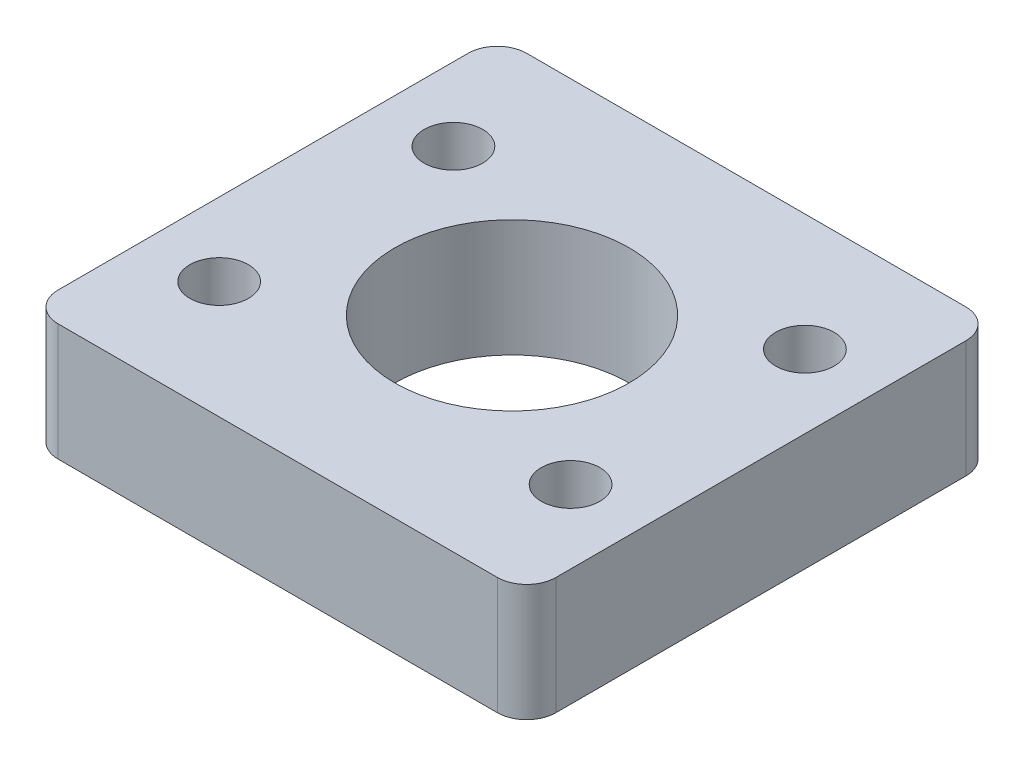
ISO-10303-21;
HEADER;
FILE_DESCRIPTION(('STEP AP214'),'2;1');
FILE_NAME('part.step','',(''),(''),'','','');
FILE_SCHEMA(('AUTOMOTIVE_DESIGN { 1 0 10303 214 1 1 1 1 }'));
ENDSEC;
DATA;
#1=APPLICATION_CONTEXT('core data for automotive mechanical design processes');
#2=APPLICATION_PROTOCOL_DEFINITION('international standard','automotive_design',2000,#1);
#3=PRODUCT_CONTEXT('',#1,'mechanical');
#4=PRODUCT('Part','Part','',(#3));
#5=PRODUCT_RELATED_PRODUCT_CATEGORY('part','',(#4));
#6=PRODUCT_DEFINITION_FORMATION('','',#4);
#7=PRODUCT_DEFINITION_CONTEXT('part definition',#1,'design');
#8=PRODUCT_DEFINITION('design','',#6,#7);
#9=PRODUCT_DEFINITION_SHAPE('','',#8);
#10=(LENGTH_UNIT() NAMED_UNIT(*) SI_UNIT(.MILLI.,.METRE.));
#11=(NAMED_UNIT(*) PLANE_ANGLE_UNIT() SI_UNIT($,.RADIAN.));
#12=(NAMED_UNIT(*) SI_UNIT($,.STERADIAN.) SOLID_ANGLE_UNIT());
#13=UNCERTAINTY_MEASURE_WITH_UNIT(LENGTH_MEASURE(1.E-05),#10,'distance_accuracy_value','');
#14=(GEOMETRIC_REPRESENTATION_CONTEXT(3) GLOBAL_UNCERTAINTY_ASSIGNED_CONTEXT((#13)) GLOBAL_UNIT_ASSIGNED_CONTEXT((#10,
#11,#12)) REPRESENTATION_CONTEXT('',''));
#15=CARTESIAN_POINT('',(0.,0.,0.));
#16=DIRECTION('',(0.,0.,1.));
#17=DIRECTION('',(1.,0.,0.));
#18=AXIS2_PLACEMENT_3D('',#15,#16,#17);
#19=CARTESIAN_POINT('',(0.,4.,0.));
#20=DIRECTION('',(0.,-1.,0.));
#21=DIRECTION('',(0.,0.,-1.));
#22=AXIS2_PLACEMENT_3D('',#19,#20,#21);
#23=PLANE('',#22);
#24=DIRECTION('',(0.,0.,-1.));
#25=VECTOR('',#24,1.);
#26=CARTESIAN_POINT('',(8.5,4.,8.));
#27=LINE('',#26,#25);
#28=CARTESIAN_POINT('',(8.5,4.,7.));
#29=VERTEX_POINT('',#28);
#30=CARTESIAN_POINT('',(8.5,4.,-7.));
#31=VERTEX_POINT('',#30);
#32=EDGE_CURVE('E144',#29,#31,#27,.T.);
#33=ORIENTED_EDGE('',*,*,#32,.T.);
#34=CARTESIAN_POINT('',(7.5,4.,-7.));
#35=DIRECTION('',(0.,-1.,0.));
#36=DIRECTION('',(0.,0.,-1.));
#37=AXIS2_PLACEMENT_3D('',#34,#35,#36);
#38=CIRCLE('',#37,1.);
#39=CARTESIAN_POINT('',(7.5,4.,-8.));
#40=VERTEX_POINT('',#39);
#41=EDGE_CURVE('E159',#31,#40,#38,.F.);
#42=ORIENTED_EDGE('',*,*,#41,.T.);
#43=DIRECTION('',(-1.,0.,0.));
#44=VECTOR('',#43,1.);
#45=CARTESIAN_POINT('',(-8.5,4.,-8.));
#46=LINE('',#45,#44);
#47=CARTESIAN_POINT('',(-7.5,4.,-8.));
#48=VERTEX_POINT('',#47);
#49=EDGE_CURVE('E126',#40,#48,#46,.T.);
#50=ORIENTED_EDGE('',*,*,#49,.T.);
#51=CARTESIAN_POINT('',(-7.5,4.,-7.));
#52=DIRECTION('',(0.,-1.,0.));
#53=DIRECTION('',(0.,0.,-1.));
#54=AXIS2_PLACEMENT_3D('',#51,#52,#53);
#55=CIRCLE('',#54,1.);
#56=CARTESIAN_POINT('',(-8.5,4.,-7.));
#57=VERTEX_POINT('',#56);
#58=EDGE_CURVE('E157',#48,#57,#55,.F.);
#59=ORIENTED_EDGE('',*,*,#58,.T.);
#60=DIRECTION('',(0.,0.,1.));
#61=VECTOR('',#60,1.);
#62=CARTESIAN_POINT('',(-8.5,4.,8.));
#63=LINE('',#62,#61);
#64=CARTESIAN_POINT('',(-8.5,4.,7.));
#65=VERTEX_POINT('',#64);
#66=EDGE_CURVE('E179',#57,#65,#63,.T.);
#67=ORIENTED_EDGE('',*,*,#66,.T.);
#68=CARTESIAN_POINT('',(-7.5,4.,7.));
#69=DIRECTION('',(0.,-1.,0.));
#70=DIRECTION('',(0.,0.,-1.));
#71=AXIS2_PLACEMENT_3D('',#68,#69,#70);
#72=CIRCLE('',#71,1.);
#73=CARTESIAN_POINT('',(-7.5,4.,8.));
#74=VERTEX_POINT('',#73);
#75=EDGE_CURVE('E61',#65,#74,#72,.F.);
#76=ORIENTED_EDGE('',*,*,#75,.T.);
#77=DIRECTION('',(1.,0.,0.));
#78=VECTOR('',#77,1.);
#79=CARTESIAN_POINT('',(-8.5,4.,8.));
#80=LINE('',#79,#78);
#81=CARTESIAN_POINT('',(7.5,4.,8.));
#82=VERTEX_POINT('',#81);
#83=EDGE_CURVE('E145',#74,#82,#80,.T.);
#84=ORIENTED_EDGE('',*,*,#83,.T.);
#85=CARTESIAN_POINT('',(7.5,4.,7.));
#86=DIRECTION('',(0.,-1.,0.));
#87=DIRECTION('',(0.,0.,-1.));
#88=AXIS2_PLACEMENT_3D('',#85,#86,#87);
#89=CIRCLE('',#88,1.);
#90=EDGE_CURVE('E155',#82,#29,#89,.F.);
#91=ORIENTED_EDGE('',*,*,#90,.T.);
#92=EDGE_LOOP('',(#33,#42,#50,#59,#67,#76,#84,#91));
#93=FACE_BOUND('',#92,.T.);
#94=CARTESIAN_POINT('',(6.,4.,-4.));
#95=DIRECTION('',(0.,1.,0.));
#96=DIRECTION('',(0.,0.,1.));
#97=AXIS2_PLACEMENT_3D('',#94,#95,#96);
#98=CIRCLE('',#97,1.);
#99=CARTESIAN_POINT('',(6.,4.,-3.));
#100=VERTEX_POINT('',#99);
#101=EDGE_CURVE('E139',#100,#100,#98,.T.);
#102=ORIENTED_EDGE('',*,*,#101,.F.);
#103=EDGE_LOOP('',(#102));
#104=FACE_BOUND('',#103,.T.);
#105=CARTESIAN_POINT('',(-6.,4.,-4.));
#106=DIRECTION('',(0.,1.,0.));
#107=DIRECTION('',(0.,0.,-1.));
#108=AXIS2_PLACEMENT_3D('',#105,#106,#107);
#109=CIRCLE('',#108,1.);
#110=CARTESIAN_POINT('',(-6.,4.,-5.));
#111=VERTEX_POINT('',#110);
#112=EDGE_CURVE('E194',#111,#111,#109,.T.);
#113=ORIENTED_EDGE('',*,*,#112,.F.);
#114=EDGE_LOOP('',(#113));
#115=FACE_BOUND('',#114,.T.);
#116=CARTESIAN_POINT('',(6.,4.,4.));
#117=DIRECTION('',(0.,1.,0.));
#118=DIRECTION('',(0.,0.,-1.));
#119=AXIS2_PLACEMENT_3D('',#116,#117,#118);
#120=CIRCLE('',#119,1.);
#121=CARTESIAN_POINT('',(6.,4.,3.));
#122=VERTEX_POINT('',#121);
#123=EDGE_CURVE('E198',#122,#122,#120,.T.);
#124=ORIENTED_EDGE('',*,*,#123,.F.);
#125=EDGE_LOOP('',(#124));
#126=FACE_BOUND('',#125,.T.);
#127=CARTESIAN_POINT('',(-6.,4.,4.));
#128=DIRECTION('',(0.,1.,0.));
#129=DIRECTION('',(0.,0.,1.));
#130=AXIS2_PLACEMENT_3D('',#127,#128,#129);
#131=CIRCLE('',#130,1.);
#132=CARTESIAN_POINT('',(-6.,4.,5.));
#133=VERTEX_POINT('',#132);
#134=EDGE_CURVE('E202',#133,#133,#131,.T.);
#135=ORIENTED_EDGE('',*,*,#134,.F.);
#136=EDGE_LOOP('',(#135));
#137=FACE_BOUND('',#136,.T.);
#138=CARTESIAN_POINT('',(0.,4.,0.));
#139=DIRECTION('',(0.,1.,0.));
#140=DIRECTION('',(0.,0.,1.));
#141=AXIS2_PLACEMENT_3D('',#138,#139,#140);
#142=CIRCLE('',#141,4.);
#143=CARTESIAN_POINT('',(0.,4.,4.));
#144=VERTEX_POINT('',#143);
#145=EDGE_CURVE('E205',#144,#144,#142,.T.);
#146=ORIENTED_EDGE('',*,*,#145,.F.);
#147=EDGE_LOOP('',(#146));
#148=FACE_BOUND('',#147,.T.);
#149=ADVANCED_FACE('F41',(#93,#104,#115,#126,#137,#148),#23,.F.);
#150=CARTESIAN_POINT('',(0.,0.,0.));
#151=DIRECTION('',(0.,-1.,0.));
#152=DIRECTION('',(0.,0.,-1.));
#153=AXIS2_PLACEMENT_3D('',#150,#151,#152);
#154=PLANE('',#153);
#155=CARTESIAN_POINT('',(-6.,0.,4.));
#156=DIRECTION('',(0.,1.,0.));
#157=DIRECTION('',(0.,0.,1.));
#158=AXIS2_PLACEMENT_3D('',#155,#156,#157);
#159=CIRCLE('',#158,1.);
#160=CARTESIAN_POINT('',(-6.,0.,5.));
#161=VERTEX_POINT('',#160);
#162=EDGE_CURVE('E207',#161,#161,#159,.T.);
#163=ORIENTED_EDGE('',*,*,#162,.T.);
#164=EDGE_LOOP('',(#163));
#165=FACE_BOUND('',#164,.T.);
#166=CARTESIAN_POINT('',(-6.,0.,-4.));
#167=DIRECTION('',(0.,1.,0.));
#168=DIRECTION('',(0.,0.,-1.));
#169=AXIS2_PLACEMENT_3D('',#166,#167,#168);
#170=CIRCLE('',#169,1.);
#171=CARTESIAN_POINT('',(-6.,0.,-5.));
#172=VERTEX_POINT('',#171);
#173=EDGE_CURVE('E218',#172,#172,#170,.T.);
#174=ORIENTED_EDGE('',*,*,#173,.T.);
#175=EDGE_LOOP('',(#174));
#176=FACE_BOUND('',#175,.T.);
#177=DIRECTION('',(-1.,0.,0.));
#178=VECTOR('',#177,1.);
#179=CARTESIAN_POINT('',(-8.5,0.,-8.));
#180=LINE('',#179,#178);
#181=CARTESIAN_POINT('',(7.5,0.,-8.));
#182=VERTEX_POINT('',#181);
#183=CARTESIAN_POINT('',(-7.5,0.,-8.));
#184=VERTEX_POINT('',#183);
#185=EDGE_CURVE('E123',#182,#184,#180,.T.);
#186=ORIENTED_EDGE('',*,*,#185,.F.);
#187=CARTESIAN_POINT('',(7.5,0.,-7.));
#188=DIRECTION('',(0.,-1.,0.));
#189=DIRECTION('',(0.,0.,-1.));
#190=AXIS2_PLACEMENT_3D('',#187,#188,#189);
#191=CIRCLE('',#190,1.);
#192=CARTESIAN_POINT('',(8.5,0.,-7.));
#193=VERTEX_POINT('',#192);
#194=EDGE_CURVE('E106',#182,#193,#191,.T.);
#195=ORIENTED_EDGE('',*,*,#194,.T.);
#196=DIRECTION('',(0.,0.,-1.));
#197=VECTOR('',#196,1.);
#198=CARTESIAN_POINT('',(8.5,0.,8.));
#199=LINE('',#198,#197);
#200=CARTESIAN_POINT('',(8.5,0.,7.));
#201=VERTEX_POINT('',#200);
#202=EDGE_CURVE('E134',#201,#193,#199,.T.);
#203=ORIENTED_EDGE('',*,*,#202,.F.);
#204=CARTESIAN_POINT('',(7.5,0.,7.));
#205=DIRECTION('',(0.,-1.,0.));
#206=DIRECTION('',(0.,0.,-1.));
#207=AXIS2_PLACEMENT_3D('',#204,#205,#206);
#208=CIRCLE('',#207,1.);
#209=CARTESIAN_POINT('',(7.5,0.,8.));
#210=VERTEX_POINT('',#209);
#211=EDGE_CURVE('E148',#201,#210,#208,.T.);
#212=ORIENTED_EDGE('',*,*,#211,.T.);
#213=DIRECTION('',(1.,0.,0.));
#214=VECTOR('',#213,1.);
#215=CARTESIAN_POINT('',(-8.5,0.,8.));
#216=LINE('',#215,#214);
#217=CARTESIAN_POINT('',(-7.5,0.,8.));
#218=VERTEX_POINT('',#217);
#219=EDGE_CURVE('E137',#218,#210,#216,.T.);
#220=ORIENTED_EDGE('',*,*,#219,.F.);
#221=CARTESIAN_POINT('',(-7.5,0.,7.));
#222=DIRECTION('',(0.,-1.,0.));
#223=DIRECTION('',(0.,0.,-1.));
#224=AXIS2_PLACEMENT_3D('',#221,#222,#223);
#225=CIRCLE('',#224,1.);
#226=CARTESIAN_POINT('',(-8.5,0.,7.));
#227=VERTEX_POINT('',#226);
#228=EDGE_CURVE('E127',#218,#227,#225,.T.);
#229=ORIENTED_EDGE('',*,*,#228,.T.);
#230=DIRECTION('',(0.,0.,1.));
#231=VECTOR('',#230,1.);
#232=CARTESIAN_POINT('',(-8.5,0.,8.));
#233=LINE('',#232,#231);
#234=CARTESIAN_POINT('',(-8.5,0.,-7.));
#235=VERTEX_POINT('',#234);
#236=EDGE_CURVE('E133',#235,#227,#233,.T.);
#237=ORIENTED_EDGE('',*,*,#236,.F.);
#238=CARTESIAN_POINT('',(-7.5,0.,-7.));
#239=DIRECTION('',(0.,-1.,0.));
#240=DIRECTION('',(0.,0.,-1.));
#241=AXIS2_PLACEMENT_3D('',#238,#239,#240);
#242=CIRCLE('',#241,1.);
#243=EDGE_CURVE('E117',#235,#184,#242,.T.);
#244=ORIENTED_EDGE('',*,*,#243,.T.);
#245=EDGE_LOOP('',(#186,#195,#203,#212,#220,#229,#237,#244));
#246=FACE_BOUND('',#245,.T.);
#247=CARTESIAN_POINT('',(6.,0.,-4.));
#248=DIRECTION('',(0.,1.,0.));
#249=DIRECTION('',(0.,0.,1.));
#250=AXIS2_PLACEMENT_3D('',#247,#248,#249);
#251=CIRCLE('',#250,1.);
#252=CARTESIAN_POINT('',(6.,0.,-3.));
#253=VERTEX_POINT('',#252);
#254=EDGE_CURVE('E182',#253,#253,#251,.T.);
#255=ORIENTED_EDGE('',*,*,#254,.T.);
#256=EDGE_LOOP('',(#255));
#257=FACE_BOUND('',#256,.T.);
#258=CARTESIAN_POINT('',(6.,0.,4.));
#259=DIRECTION('',(0.,1.,0.));
#260=DIRECTION('',(0.,0.,-1.));
#261=AXIS2_PLACEMENT_3D('',#258,#259,#260);
#262=CIRCLE('',#261,1.);
#263=CARTESIAN_POINT('',(6.,0.,3.));
#264=VERTEX_POINT('',#263);
#265=EDGE_CURVE('E215',#264,#264,#262,.T.);
#266=ORIENTED_EDGE('',*,*,#265,.T.);
#267=EDGE_LOOP('',(#266));
#268=FACE_BOUND('',#267,.T.);
#269=CARTESIAN_POINT('',(0.,0.,0.));
#270=DIRECTION('',(0.,1.,0.));
#271=DIRECTION('',(0.,0.,1.));
#272=AXIS2_PLACEMENT_3D('',#269,#270,#271);
#273=CIRCLE('',#272,4.);
#274=CARTESIAN_POINT('',(0.,0.,4.));
#275=VERTEX_POINT('',#274);
#276=EDGE_CURVE('E208',#275,#275,#273,.T.);
#277=ORIENTED_EDGE('',*,*,#276,.T.);
#278=EDGE_LOOP('',(#277));
#279=FACE_BOUND('',#278,.T.);
#280=ADVANCED_FACE('F130',(#165,#176,#246,#257,#268,#279),#154,.T.);
#281=CARTESIAN_POINT('',(8.5,4.,8.));
#282=DIRECTION('',(-1.,0.,0.));
#283=DIRECTION('',(0.,0.,1.));
#284=AXIS2_PLACEMENT_3D('',#281,#282,#283);
#285=PLANE('',#284);
#286=ORIENTED_EDGE('',*,*,#202,.T.);
#287=DIRECTION('',(0.,-1.,0.));
#288=VECTOR('',#287,1.);
#289=CARTESIAN_POINT('',(8.5,4.,-7.));
#290=LINE('',#289,#288);
#291=EDGE_CURVE('E111',#193,#31,#290,.F.);
#292=ORIENTED_EDGE('',*,*,#291,.T.);
#293=ORIENTED_EDGE('',*,*,#32,.F.);
#294=DIRECTION('',(0.,-1.,0.));
#295=VECTOR('',#294,1.);
#296=CARTESIAN_POINT('',(8.5,4.,7.));
#297=LINE('',#296,#295);
#298=EDGE_CURVE('E116',#29,#201,#297,.T.);
#299=ORIENTED_EDGE('',*,*,#298,.T.);
#300=EDGE_LOOP('',(#286,#292,#293,#299));
#301=FACE_BOUND('',#300,.T.);
#302=ADVANCED_FACE('F176',(#301),#285,.F.);
#303=CARTESIAN_POINT('',(-8.5,4.,-8.));
#304=DIRECTION('',(0.,0.,1.));
#305=DIRECTION('',(1.,0.,0.));
#306=AXIS2_PLACEMENT_3D('',#303,#304,#305);
#307=PLANE('',#306);
#308=ORIENTED_EDGE('',*,*,#49,.F.);
#309=DIRECTION('',(0.,-1.,0.));
#310=VECTOR('',#309,1.);
#311=CARTESIAN_POINT('',(7.5,4.,-8.));
#312=LINE('',#311,#310);
#313=EDGE_CURVE('E110',#40,#182,#312,.T.);
#314=ORIENTED_EDGE('',*,*,#313,.T.);
#315=ORIENTED_EDGE('',*,*,#185,.T.);
#316=DIRECTION('',(0.,-1.,0.));
#317=VECTOR('',#316,1.);
#318=CARTESIAN_POINT('',(-7.5,4.,-8.));
#319=LINE('',#318,#317);
#320=EDGE_CURVE('E128',#184,#48,#319,.F.);
#321=ORIENTED_EDGE('',*,*,#320,.T.);
#322=EDGE_LOOP('',(#308,#314,#315,#321));
#323=FACE_BOUND('',#322,.T.);
#324=ADVANCED_FACE('F122',(#323),#307,.F.);
#325=CARTESIAN_POINT('',(-8.5,4.,8.));
#326=DIRECTION('',(1.,0.,0.));
#327=DIRECTION('',(0.,0.,-1.));
#328=AXIS2_PLACEMENT_3D('',#325,#326,#327);
#329=PLANE('',#328);
#330=ORIENTED_EDGE('',*,*,#66,.F.);
#331=DIRECTION('',(0.,-1.,0.));
#332=VECTOR('',#331,1.);
#333=CARTESIAN_POINT('',(-8.5,4.,-7.));
#334=LINE('',#333,#332);
#335=EDGE_CURVE('E163',#57,#235,#334,.T.);
#336=ORIENTED_EDGE('',*,*,#335,.T.);
#337=ORIENTED_EDGE('',*,*,#236,.T.);
#338=DIRECTION('',(0.,-1.,0.));
#339=VECTOR('',#338,1.);
#340=CARTESIAN_POINT('',(-8.5,4.,7.));
#341=LINE('',#340,#339);
#342=EDGE_CURVE('E161',#227,#65,#341,.F.);
#343=ORIENTED_EDGE('',*,*,#342,.T.);
#344=EDGE_LOOP('',(#330,#336,#337,#343));
#345=FACE_BOUND('',#344,.T.);
#346=ADVANCED_FACE('F239',(#345),#329,.F.);
#347=CARTESIAN_POINT('',(-8.5,4.,8.));
#348=DIRECTION('',(0.,0.,-1.));
#349=DIRECTION('',(-1.,0.,0.));
#350=AXIS2_PLACEMENT_3D('',#347,#348,#349);
#351=PLANE('',#350);
#352=ORIENTED_EDGE('',*,*,#219,.T.);
#353=DIRECTION('',(0.,-1.,0.));
#354=VECTOR('',#353,1.);
#355=CARTESIAN_POINT('',(7.5,4.,8.));
#356=LINE('',#355,#354);
#357=EDGE_CURVE('E11',#210,#82,#356,.F.);
#358=ORIENTED_EDGE('',*,*,#357,.T.);
#359=ORIENTED_EDGE('',*,*,#83,.F.);
#360=DIRECTION('',(0.,-1.,0.));
#361=VECTOR('',#360,1.);
#362=CARTESIAN_POINT('',(-7.5,4.,8.));
#363=LINE('',#362,#361);
#364=EDGE_CURVE('E49',#74,#218,#363,.T.);
#365=ORIENTED_EDGE('',*,*,#364,.T.);
#366=EDGE_LOOP('',(#352,#358,#359,#365));
#367=FACE_BOUND('',#366,.T.);
#368=ADVANCED_FACE('F168',(#367),#351,.F.);
#369=CARTESIAN_POINT('',(6.,4.,-4.));
#370=DIRECTION('',(0.,-1.,0.));
#371=DIRECTION('',(0.,0.,-1.));
#372=AXIS2_PLACEMENT_3D('',#369,#370,#371);
#373=CYLINDRICAL_SURFACE('',#372,1.);
#374=ORIENTED_EDGE('',*,*,#101,.T.);
#375=EDGE_LOOP('',(#374));
#376=FACE_BOUND('',#375,.T.);
#377=ORIENTED_EDGE('',*,*,#254,.F.);
#378=EDGE_LOOP('',(#377));
#379=FACE_BOUND('',#378,.T.);
#380=ADVANCED_FACE('F228',(#376,#379),#373,.F.);
#381=CARTESIAN_POINT('',(-6.,4.,-4.));
#382=DIRECTION('',(0.,-1.,0.));
#383=DIRECTION('',(0.,0.,-1.));
#384=AXIS2_PLACEMENT_3D('',#381,#382,#383);
#385=CYLINDRICAL_SURFACE('',#384,1.);
#386=ORIENTED_EDGE('',*,*,#112,.T.);
#387=EDGE_LOOP('',(#386));
#388=FACE_BOUND('',#387,.T.);
#389=ORIENTED_EDGE('',*,*,#173,.F.);
#390=EDGE_LOOP('',(#389));
#391=FACE_BOUND('',#390,.T.);
#392=ADVANCED_FACE('F230',(#388,#391),#385,.F.);
#393=CARTESIAN_POINT('',(6.,4.,4.));
#394=DIRECTION('',(0.,-1.,0.));
#395=DIRECTION('',(0.,0.,-1.));
#396=AXIS2_PLACEMENT_3D('',#393,#394,#395);
#397=CYLINDRICAL_SURFACE('',#396,1.);
#398=ORIENTED_EDGE('',*,*,#123,.T.);
#399=EDGE_LOOP('',(#398));
#400=FACE_BOUND('',#399,.T.);
#401=ORIENTED_EDGE('',*,*,#265,.F.);
#402=EDGE_LOOP('',(#401));
#403=FACE_BOUND('',#402,.T.);
#404=ADVANCED_FACE('F235',(#400,#403),#397,.F.);
#405=CARTESIAN_POINT('',(-6.,4.,4.));
#406=DIRECTION('',(0.,-1.,0.));
#407=DIRECTION('',(0.,0.,-1.));
#408=AXIS2_PLACEMENT_3D('',#405,#406,#407);
#409=CYLINDRICAL_SURFACE('',#408,1.);
#410=ORIENTED_EDGE('',*,*,#134,.T.);
#411=EDGE_LOOP('',(#410));
#412=FACE_BOUND('',#411,.T.);
#413=ORIENTED_EDGE('',*,*,#162,.F.);
#414=EDGE_LOOP('',(#413));
#415=FACE_BOUND('',#414,.T.);
#416=ADVANCED_FACE('F295',(#412,#415),#409,.F.);
#417=CARTESIAN_POINT('',(0.,4.,0.));
#418=DIRECTION('',(0.,-1.,0.));
#419=DIRECTION('',(0.,0.,-1.));
#420=AXIS2_PLACEMENT_3D('',#417,#418,#419);
#421=CYLINDRICAL_SURFACE('',#420,4.);
#422=ORIENTED_EDGE('',*,*,#145,.T.);
#423=EDGE_LOOP('',(#422));
#424=FACE_BOUND('',#423,.T.);
#425=ORIENTED_EDGE('',*,*,#276,.F.);
#426=EDGE_LOOP('',(#425));
#427=FACE_BOUND('',#426,.T.);
#428=ADVANCED_FACE('F256',(#424,#427),#421,.F.);
#429=CARTESIAN_POINT('',(7.5,4.,-7.));
#430=DIRECTION('',(0.,-1.,0.));
#431=DIRECTION('',(0.,0.,-1.));
#432=AXIS2_PLACEMENT_3D('',#429,#430,#431);
#433=CYLINDRICAL_SURFACE('',#432,1.);
#434=ORIENTED_EDGE('',*,*,#41,.F.);
#435=ORIENTED_EDGE('',*,*,#291,.F.);
#436=ORIENTED_EDGE('',*,*,#194,.F.);
#437=ORIENTED_EDGE('',*,*,#313,.F.);
#438=EDGE_LOOP('',(#434,#435,#436,#437));
#439=FACE_BOUND('',#438,.T.);
#440=ADVANCED_FACE('F109',(#439),#433,.T.);
#441=CARTESIAN_POINT('',(-7.5,4.,-7.));
#442=DIRECTION('',(0.,-1.,0.));
#443=DIRECTION('',(0.,0.,-1.));
#444=AXIS2_PLACEMENT_3D('',#441,#442,#443);
#445=CYLINDRICAL_SURFACE('',#444,1.);
#446=ORIENTED_EDGE('',*,*,#58,.F.);
#447=ORIENTED_EDGE('',*,*,#320,.F.);
#448=ORIENTED_EDGE('',*,*,#243,.F.);
#449=ORIENTED_EDGE('',*,*,#335,.F.);
#450=EDGE_LOOP('',(#446,#447,#448,#449));
#451=FACE_BOUND('',#450,.T.);
#452=ADVANCED_FACE('F255',(#451),#445,.T.);
#453=CARTESIAN_POINT('',(7.5,4.,7.));
#454=DIRECTION('',(0.,-1.,0.));
#455=DIRECTION('',(0.,0.,-1.));
#456=AXIS2_PLACEMENT_3D('',#453,#454,#455);
#457=CYLINDRICAL_SURFACE('',#456,1.);
#458=ORIENTED_EDGE('',*,*,#90,.F.);
#459=ORIENTED_EDGE('',*,*,#357,.F.);
#460=ORIENTED_EDGE('',*,*,#211,.F.);
#461=ORIENTED_EDGE('',*,*,#298,.F.);
#462=EDGE_LOOP('',(#458,#459,#460,#461));
#463=FACE_BOUND('',#462,.T.);
#464=ADVANCED_FACE('F173',(#463),#457,.T.);
#465=CARTESIAN_POINT('',(-7.5,4.,7.));
#466=DIRECTION('',(0.,-1.,0.));
#467=DIRECTION('',(0.,0.,-1.));
#468=AXIS2_PLACEMENT_3D('',#465,#466,#467);
#469=CYLINDRICAL_SURFACE('',#468,1.);
#470=ORIENTED_EDGE('',*,*,#75,.F.);
#471=ORIENTED_EDGE('',*,*,#342,.F.);
#472=ORIENTED_EDGE('',*,*,#228,.F.);
#473=ORIENTED_EDGE('',*,*,#364,.F.);
#474=EDGE_LOOP('',(#470,#471,#472,#473));
#475=FACE_BOUND('',#474,.T.);
#476=ADVANCED_FACE('F43',(#475),#469,.T.);
#477=CLOSED_SHELL('',(#149,#280,#302,#324,#346,#368,#380,#392,#404,#416,#428,#440,#452,#464,#476));
#478=MANIFOLD_SOLID_BREP('B2',#477);
#479=ADVANCED_BREP_SHAPE_REPRESENTATION('',(#18,#478),#14);
#480=SHAPE_DEFINITION_REPRESENTATION(#9,#479);
ENDSEC;
END-ISO-10303-21;
